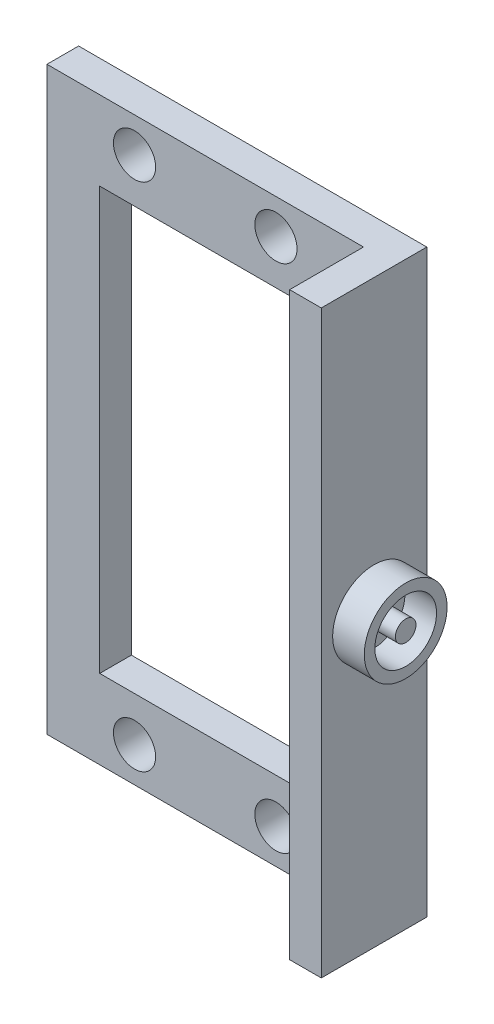
ISO-10303-21;
HEADER;
FILE_DESCRIPTION(('STEP AP214'),'2;1');
FILE_NAME('part.step','',(''),(''),'','','');
FILE_SCHEMA(('AUTOMOTIVE_DESIGN { 1 0 10303 214 1 1 1 1 }'));
ENDSEC;
DATA;
#1=APPLICATION_CONTEXT('core data for automotive mechanical design processes');
#2=APPLICATION_PROTOCOL_DEFINITION('international standard','automotive_design',2000,#1);
#3=PRODUCT_CONTEXT('',#1,'mechanical');
#4=PRODUCT('Part','Part','',(#3));
#5=PRODUCT_RELATED_PRODUCT_CATEGORY('part','',(#4));
#6=PRODUCT_DEFINITION_FORMATION('','',#4);
#7=PRODUCT_DEFINITION_CONTEXT('part definition',#1,'design');
#8=PRODUCT_DEFINITION('design','',#6,#7);
#9=PRODUCT_DEFINITION_SHAPE('','',#8);
#10=(LENGTH_UNIT() NAMED_UNIT(*) SI_UNIT(.MILLI.,.METRE.));
#11=(NAMED_UNIT(*) PLANE_ANGLE_UNIT() SI_UNIT($,.RADIAN.));
#12=(NAMED_UNIT(*) SI_UNIT($,.STERADIAN.) SOLID_ANGLE_UNIT());
#13=UNCERTAINTY_MEASURE_WITH_UNIT(LENGTH_MEASURE(1.E-05),#10,'distance_accuracy_value','');
#14=(GEOMETRIC_REPRESENTATION_CONTEXT(3) GLOBAL_UNCERTAINTY_ASSIGNED_CONTEXT((#13)) GLOBAL_UNIT_ASSIGNED_CONTEXT((#10,
#11,#12)) REPRESENTATION_CONTEXT('',''));
#15=CARTESIAN_POINT('',(0.,0.,0.));
#16=DIRECTION('',(0.,0.,1.));
#17=DIRECTION('',(1.,0.,0.));
#18=AXIS2_PLACEMENT_3D('',#15,#16,#17);
#19=CARTESIAN_POINT('',(0.,0.,3.));
#20=DIRECTION('',(0.,0.,-1.));
#21=DIRECTION('',(-1.,0.,0.));
#22=AXIS2_PLACEMENT_3D('',#19,#20,#21);
#23=PLANE('',#22);
#24=CARTESIAN_POINT('',(-6.69999999999999,44.2,3.));
#25=DIRECTION('',(0.,0.,1.));
#26=DIRECTION('',(1.,0.,0.));
#27=AXIS2_PLACEMENT_3D('',#24,#25,#26);
#28=CIRCLE('',#27,2.);
#29=CARTESIAN_POINT('',(-4.69999999999999,44.2,3.));
#30=VERTEX_POINT('',#29);
#31=EDGE_CURVE('E186',#30,#30,#28,.T.);
#32=ORIENTED_EDGE('',*,*,#31,.F.);
#33=EDGE_LOOP('',(#32));
#34=FACE_BOUND('',#33,.T.);
#35=CARTESIAN_POINT('',(-6.69999999999999,-4.2,3.));
#36=DIRECTION('',(0.,0.,1.));
#37=DIRECTION('',(1.,0.,0.));
#38=AXIS2_PLACEMENT_3D('',#35,#36,#37);
#39=CIRCLE('',#38,2.);
#40=CARTESIAN_POINT('',(-4.69999999999999,-4.2,3.));
#41=VERTEX_POINT('',#40);
#42=EDGE_CURVE('E195',#41,#41,#39,.T.);
#43=ORIENTED_EDGE('',*,*,#42,.F.);
#44=EDGE_LOOP('',(#43));
#45=FACE_BOUND('',#44,.T.);
#46=CARTESIAN_POINT('',(6.70000000000001,44.2,3.));
#47=DIRECTION('',(0.,0.,1.));
#48=DIRECTION('',(1.,0.,0.));
#49=AXIS2_PLACEMENT_3D('',#46,#47,#48);
#50=CIRCLE('',#49,2.);
#51=CARTESIAN_POINT('',(8.70000000000001,44.2,3.));
#52=VERTEX_POINT('',#51);
#53=EDGE_CURVE('E203',#52,#52,#50,.T.);
#54=ORIENTED_EDGE('',*,*,#53,.F.);
#55=EDGE_LOOP('',(#54));
#56=FACE_BOUND('',#55,.T.);
#57=CARTESIAN_POINT('',(6.70000000000001,-4.2,3.));
#58=DIRECTION('',(0.,0.,1.));
#59=DIRECTION('',(1.,0.,0.));
#60=AXIS2_PLACEMENT_3D('',#57,#58,#59);
#61=CIRCLE('',#60,2.);
#62=CARTESIAN_POINT('',(8.70000000000001,-4.2,3.));
#63=VERTEX_POINT('',#62);
#64=EDGE_CURVE('E211',#63,#63,#61,.T.);
#65=ORIENTED_EDGE('',*,*,#64,.F.);
#66=EDGE_LOOP('',(#65));
#67=FACE_BOUND('',#66,.T.);
#68=DIRECTION('',(0.,-1.,0.));
#69=VECTOR('',#68,1.);
#70=CARTESIAN_POINT('',(-15.,-7.5,3.));
#71=LINE('',#70,#69);
#72=CARTESIAN_POINT('',(-15.,47.5,3.));
#73=VERTEX_POINT('',#72);
#74=CARTESIAN_POINT('',(-15.,-7.5,3.));
#75=VERTEX_POINT('',#74);
#76=EDGE_CURVE('E254',#73,#75,#71,.T.);
#77=ORIENTED_EDGE('',*,*,#76,.T.);
#78=DIRECTION('',(1.,0.,0.));
#79=VECTOR('',#78,1.);
#80=CARTESIAN_POINT('',(-15.,-7.5,3.));
#81=LINE('',#80,#79);
#82=CARTESIAN_POINT('',(15.,-7.5,3.));
#83=VERTEX_POINT('',#82);
#84=EDGE_CURVE('E258',#75,#83,#81,.T.);
#85=ORIENTED_EDGE('',*,*,#84,.T.);
#86=DIRECTION('',(0.,1.,0.));
#87=VECTOR('',#86,1.);
#88=CARTESIAN_POINT('',(15.,-7.5,3.));
#89=LINE('',#88,#87);
#90=CARTESIAN_POINT('',(15.,47.5,3.));
#91=VERTEX_POINT('',#90);
#92=EDGE_CURVE('E263',#83,#91,#89,.T.);
#93=ORIENTED_EDGE('',*,*,#92,.T.);
#94=DIRECTION('',(-1.,0.,0.));
#95=VECTOR('',#94,1.);
#96=CARTESIAN_POINT('',(-15.,47.5,3.));
#97=LINE('',#96,#95);
#98=EDGE_CURVE('E267',#91,#73,#97,.T.);
#99=ORIENTED_EDGE('',*,*,#98,.T.);
#100=EDGE_LOOP('',(#77,#85,#93,#99));
#101=FACE_BOUND('',#100,.T.);
#102=DIRECTION('',(0.,-1.,0.));
#103=VECTOR('',#102,1.);
#104=CARTESIAN_POINT('',(-10.,0.,3.));
#105=LINE('',#104,#103);
#106=CARTESIAN_POINT('',(-10.,40.,3.));
#107=VERTEX_POINT('',#106);
#108=CARTESIAN_POINT('',(-10.,0.,3.));
#109=VERTEX_POINT('',#108);
#110=EDGE_CURVE('E216',#107,#109,#105,.T.);
#111=ORIENTED_EDGE('',*,*,#110,.F.);
#112=DIRECTION('',(-1.,0.,0.));
#113=VECTOR('',#112,1.);
#114=CARTESIAN_POINT('',(-10.,40.,3.));
#115=LINE('',#114,#113);
#116=CARTESIAN_POINT('',(10.,40.,3.));
#117=VERTEX_POINT('',#116);
#118=EDGE_CURVE('E226',#117,#107,#115,.T.);
#119=ORIENTED_EDGE('',*,*,#118,.F.);
#120=DIRECTION('',(0.,1.,0.));
#121=VECTOR('',#120,1.);
#122=CARTESIAN_POINT('',(10.,0.,3.));
#123=LINE('',#122,#121);
#124=CARTESIAN_POINT('',(10.,0.,3.));
#125=VERTEX_POINT('',#124);
#126=EDGE_CURVE('E223',#125,#117,#123,.T.);
#127=ORIENTED_EDGE('',*,*,#126,.F.);
#128=DIRECTION('',(1.,0.,0.));
#129=VECTOR('',#128,1.);
#130=CARTESIAN_POINT('',(-10.,0.,3.));
#131=LINE('',#130,#129);
#132=EDGE_CURVE('E219',#109,#125,#131,.T.);
#133=ORIENTED_EDGE('',*,*,#132,.F.);
#134=EDGE_LOOP('',(#111,#119,#127,#133));
#135=FACE_BOUND('',#134,.T.);
#136=ADVANCED_FACE('F57',(#34,#45,#56,#67,#101,#135),#23,.F.);
#137=CARTESIAN_POINT('',(0.,0.,0.));
#138=DIRECTION('',(0.,0.,-1.));
#139=DIRECTION('',(-1.,0.,0.));
#140=AXIS2_PLACEMENT_3D('',#137,#138,#139);
#141=PLANE('',#140);
#142=CARTESIAN_POINT('',(-6.69999999999999,44.2,0.));
#143=DIRECTION('',(0.,0.,-1.));
#144=DIRECTION('',(-1.,0.,0.));
#145=AXIS2_PLACEMENT_3D('',#142,#143,#144);
#146=CIRCLE('',#145,2.);
#147=CARTESIAN_POINT('',(-8.69999999999999,44.2,0.));
#148=VERTEX_POINT('',#147);
#149=EDGE_CURVE('E191',#148,#148,#146,.T.);
#150=ORIENTED_EDGE('',*,*,#149,.F.);
#151=EDGE_LOOP('',(#150));
#152=FACE_BOUND('',#151,.T.);
#153=CARTESIAN_POINT('',(-6.69999999999999,-4.2,0.));
#154=DIRECTION('',(0.,0.,-1.));
#155=DIRECTION('',(-1.,0.,0.));
#156=AXIS2_PLACEMENT_3D('',#153,#154,#155);
#157=CIRCLE('',#156,2.);
#158=CARTESIAN_POINT('',(-8.69999999999999,-4.2,0.));
#159=VERTEX_POINT('',#158);
#160=EDGE_CURVE('E199',#159,#159,#157,.T.);
#161=ORIENTED_EDGE('',*,*,#160,.F.);
#162=EDGE_LOOP('',(#161));
#163=FACE_BOUND('',#162,.T.);
#164=CARTESIAN_POINT('',(6.70000000000001,44.2,0.));
#165=DIRECTION('',(0.,0.,-1.));
#166=DIRECTION('',(-1.,0.,0.));
#167=AXIS2_PLACEMENT_3D('',#164,#165,#166);
#168=CIRCLE('',#167,2.);
#169=CARTESIAN_POINT('',(4.70000000000001,44.2,0.));
#170=VERTEX_POINT('',#169);
#171=EDGE_CURVE('E207',#170,#170,#168,.T.);
#172=ORIENTED_EDGE('',*,*,#171,.F.);
#173=EDGE_LOOP('',(#172));
#174=FACE_BOUND('',#173,.T.);
#175=CARTESIAN_POINT('',(6.70000000000001,-4.2,0.));
#176=DIRECTION('',(0.,0.,-1.));
#177=DIRECTION('',(-1.,0.,0.));
#178=AXIS2_PLACEMENT_3D('',#175,#176,#177);
#179=CIRCLE('',#178,2.);
#180=CARTESIAN_POINT('',(4.70000000000001,-4.2,0.));
#181=VERTEX_POINT('',#180);
#182=EDGE_CURVE('E215',#181,#181,#179,.T.);
#183=ORIENTED_EDGE('',*,*,#182,.F.);
#184=EDGE_LOOP('',(#183));
#185=FACE_BOUND('',#184,.T.);
#186=DIRECTION('',(0.,-1.,0.));
#187=VECTOR('',#186,1.);
#188=CARTESIAN_POINT('',(-15.,-7.5,0.));
#189=LINE('',#188,#187);
#190=CARTESIAN_POINT('',(-15.,47.5,0.));
#191=VERTEX_POINT('',#190);
#192=CARTESIAN_POINT('',(-15.,-7.5,0.));
#193=VERTEX_POINT('',#192);
#194=EDGE_CURVE('E253',#191,#193,#189,.T.);
#195=ORIENTED_EDGE('',*,*,#194,.F.);
#196=DIRECTION('',(-1.,0.,0.));
#197=VECTOR('',#196,1.);
#198=CARTESIAN_POINT('',(-15.,47.5,0.));
#199=LINE('',#198,#197);
#200=CARTESIAN_POINT('',(18.,47.5,0.));
#201=VERTEX_POINT('',#200);
#202=EDGE_CURVE('E259',#201,#191,#199,.T.);
#203=ORIENTED_EDGE('',*,*,#202,.F.);
#204=DIRECTION('',(0.,1.,0.));
#205=VECTOR('',#204,1.);
#206=CARTESIAN_POINT('',(18.,-7.5,0.));
#207=LINE('',#206,#205);
#208=CARTESIAN_POINT('',(18.,-7.5,0.));
#209=VERTEX_POINT('',#208);
#210=EDGE_CURVE('E150',#209,#201,#207,.T.);
#211=ORIENTED_EDGE('',*,*,#210,.F.);
#212=DIRECTION('',(1.,0.,0.));
#213=VECTOR('',#212,1.);
#214=CARTESIAN_POINT('',(-15.,-7.5,0.));
#215=LINE('',#214,#213);
#216=EDGE_CURVE('E164',#193,#209,#215,.T.);
#217=ORIENTED_EDGE('',*,*,#216,.F.);
#218=EDGE_LOOP('',(#195,#203,#211,#217));
#219=FACE_BOUND('',#218,.T.);
#220=DIRECTION('',(-1.,0.,0.));
#221=VECTOR('',#220,1.);
#222=CARTESIAN_POINT('',(-10.,40.,0.));
#223=LINE('',#222,#221);
#224=CARTESIAN_POINT('',(10.,40.,0.));
#225=VERTEX_POINT('',#224);
#226=CARTESIAN_POINT('',(-10.,40.,0.));
#227=VERTEX_POINT('',#226);
#228=EDGE_CURVE('E220',#225,#227,#223,.T.);
#229=ORIENTED_EDGE('',*,*,#228,.T.);
#230=DIRECTION('',(0.,-1.,0.));
#231=VECTOR('',#230,1.);
#232=CARTESIAN_POINT('',(-10.,0.,0.));
#233=LINE('',#232,#231);
#234=CARTESIAN_POINT('',(-10.,0.,0.));
#235=VERTEX_POINT('',#234);
#236=EDGE_CURVE('E81',#227,#235,#233,.T.);
#237=ORIENTED_EDGE('',*,*,#236,.T.);
#238=DIRECTION('',(1.,0.,0.));
#239=VECTOR('',#238,1.);
#240=CARTESIAN_POINT('',(-10.,0.,0.));
#241=LINE('',#240,#239);
#242=CARTESIAN_POINT('',(10.,0.,0.));
#243=VERTEX_POINT('',#242);
#244=EDGE_CURVE('E232',#235,#243,#241,.T.);
#245=ORIENTED_EDGE('',*,*,#244,.T.);
#246=DIRECTION('',(0.,1.,0.));
#247=VECTOR('',#246,1.);
#248=CARTESIAN_POINT('',(10.,0.,0.));
#249=LINE('',#248,#247);
#250=EDGE_CURVE('E236',#243,#225,#249,.T.);
#251=ORIENTED_EDGE('',*,*,#250,.T.);
#252=EDGE_LOOP('',(#229,#237,#245,#251));
#253=FACE_BOUND('',#252,.T.);
#254=ADVANCED_FACE('F289',(#152,#163,#174,#185,#219,#253),#141,.T.);
#255=CARTESIAN_POINT('',(-15.,-7.5,3.));
#256=DIRECTION('',(1.,0.,0.));
#257=DIRECTION('',(0.,0.,-1.));
#258=AXIS2_PLACEMENT_3D('',#255,#256,#257);
#259=PLANE('',#258);
#260=ORIENTED_EDGE('',*,*,#194,.T.);
#261=DIRECTION('',(0.,0.,-1.));
#262=VECTOR('',#261,1.);
#263=CARTESIAN_POINT('',(-15.,-7.5,3.));
#264=LINE('',#263,#262);
#265=EDGE_CURVE('E66',#75,#193,#264,.T.);
#266=ORIENTED_EDGE('',*,*,#265,.F.);
#267=ORIENTED_EDGE('',*,*,#76,.F.);
#268=DIRECTION('',(0.,0.,-1.));
#269=VECTOR('',#268,1.);
#270=CARTESIAN_POINT('',(-15.,47.5,3.));
#271=LINE('',#270,#269);
#272=EDGE_CURVE('E270',#73,#191,#271,.T.);
#273=ORIENTED_EDGE('',*,*,#272,.T.);
#274=EDGE_LOOP('',(#260,#266,#267,#273));
#275=FACE_BOUND('',#274,.T.);
#276=ADVANCED_FACE('F59',(#275),#259,.F.);
#277=CARTESIAN_POINT('',(-15.,-7.5,3.));
#278=DIRECTION('',(0.,1.,0.));
#279=DIRECTION('',(0.,0.,1.));
#280=AXIS2_PLACEMENT_3D('',#277,#278,#279);
#281=PLANE('',#280);
#282=ORIENTED_EDGE('',*,*,#216,.T.);
#283=DIRECTION('',(0.,0.,1.));
#284=VECTOR('',#283,1.);
#285=CARTESIAN_POINT('',(18.,-7.5,0.));
#286=LINE('',#285,#284);
#287=CARTESIAN_POINT('',(18.,-7.5,10.));
#288=VERTEX_POINT('',#287);
#289=EDGE_CURVE('E156',#209,#288,#286,.T.);
#290=ORIENTED_EDGE('',*,*,#289,.T.);
#291=DIRECTION('',(-1.,0.,0.));
#292=VECTOR('',#291,1.);
#293=CARTESIAN_POINT('',(18.,-7.5,10.));
#294=LINE('',#293,#292);
#295=CARTESIAN_POINT('',(15.,-7.5,10.));
#296=VERTEX_POINT('',#295);
#297=EDGE_CURVE('E138',#288,#296,#294,.T.);
#298=ORIENTED_EDGE('',*,*,#297,.T.);
#299=DIRECTION('',(0.,0.,1.));
#300=VECTOR('',#299,1.);
#301=CARTESIAN_POINT('',(15.,-7.5,0.));
#302=LINE('',#301,#300);
#303=EDGE_CURVE('E179',#83,#296,#302,.T.);
#304=ORIENTED_EDGE('',*,*,#303,.F.);
#305=ORIENTED_EDGE('',*,*,#84,.F.);
#306=ORIENTED_EDGE('',*,*,#265,.T.);
#307=EDGE_LOOP('',(#282,#290,#298,#304,#305,#306));
#308=FACE_BOUND('',#307,.T.);
#309=ADVANCED_FACE('F162',(#308),#281,.F.);
#310=CARTESIAN_POINT('',(-15.,47.5,3.));
#311=DIRECTION('',(0.,-1.,0.));
#312=DIRECTION('',(0.,0.,-1.));
#313=AXIS2_PLACEMENT_3D('',#310,#311,#312);
#314=PLANE('',#313);
#315=ORIENTED_EDGE('',*,*,#202,.T.);
#316=ORIENTED_EDGE('',*,*,#272,.F.);
#317=ORIENTED_EDGE('',*,*,#98,.F.);
#318=DIRECTION('',(0.,0.,1.));
#319=VECTOR('',#318,1.);
#320=CARTESIAN_POINT('',(15.,47.5,0.));
#321=LINE('',#320,#319);
#322=CARTESIAN_POINT('',(15.,47.5,10.));
#323=VERTEX_POINT('',#322);
#324=EDGE_CURVE('E167',#91,#323,#321,.T.);
#325=ORIENTED_EDGE('',*,*,#324,.T.);
#326=DIRECTION('',(-1.,0.,0.));
#327=VECTOR('',#326,1.);
#328=CARTESIAN_POINT('',(18.,47.5,10.));
#329=LINE('',#328,#327);
#330=CARTESIAN_POINT('',(18.,47.5,10.));
#331=VERTEX_POINT('',#330);
#332=EDGE_CURVE('E149',#331,#323,#329,.T.);
#333=ORIENTED_EDGE('',*,*,#332,.F.);
#334=DIRECTION('',(0.,0.,1.));
#335=VECTOR('',#334,1.);
#336=CARTESIAN_POINT('',(18.,47.5,0.));
#337=LINE('',#336,#335);
#338=EDGE_CURVE('E158',#201,#331,#337,.T.);
#339=ORIENTED_EDGE('',*,*,#338,.F.);
#340=EDGE_LOOP('',(#315,#316,#317,#325,#333,#339));
#341=FACE_BOUND('',#340,.T.);
#342=ADVANCED_FACE('F327',(#341),#314,.F.);
#343=CARTESIAN_POINT('',(-10.,0.,3.));
#344=DIRECTION('',(1.,0.,0.));
#345=DIRECTION('',(0.,0.,-1.));
#346=AXIS2_PLACEMENT_3D('',#343,#344,#345);
#347=PLANE('',#346);
#348=ORIENTED_EDGE('',*,*,#236,.F.);
#349=DIRECTION('',(0.,0.,-1.));
#350=VECTOR('',#349,1.);
#351=CARTESIAN_POINT('',(-10.,40.,3.));
#352=LINE('',#351,#350);
#353=EDGE_CURVE('E229',#107,#227,#352,.T.);
#354=ORIENTED_EDGE('',*,*,#353,.F.);
#355=ORIENTED_EDGE('',*,*,#110,.T.);
#356=DIRECTION('',(0.,0.,-1.));
#357=VECTOR('',#356,1.);
#358=CARTESIAN_POINT('',(-10.,0.,3.));
#359=LINE('',#358,#357);
#360=EDGE_CURVE('E250',#109,#235,#359,.T.);
#361=ORIENTED_EDGE('',*,*,#360,.T.);
#362=EDGE_LOOP('',(#348,#354,#355,#361));
#363=FACE_BOUND('',#362,.T.);
#364=ADVANCED_FACE('F300',(#363),#347,.T.);
#365=CARTESIAN_POINT('',(-10.,0.,3.));
#366=DIRECTION('',(0.,1.,0.));
#367=DIRECTION('',(0.,0.,1.));
#368=AXIS2_PLACEMENT_3D('',#365,#366,#367);
#369=PLANE('',#368);
#370=ORIENTED_EDGE('',*,*,#244,.F.);
#371=ORIENTED_EDGE('',*,*,#360,.F.);
#372=ORIENTED_EDGE('',*,*,#132,.T.);
#373=DIRECTION('',(0.,0.,-1.));
#374=VECTOR('',#373,1.);
#375=CARTESIAN_POINT('',(10.,0.,3.));
#376=LINE('',#375,#374);
#377=EDGE_CURVE('E247',#125,#243,#376,.T.);
#378=ORIENTED_EDGE('',*,*,#377,.T.);
#379=EDGE_LOOP('',(#370,#371,#372,#378));
#380=FACE_BOUND('',#379,.T.);
#381=ADVANCED_FACE('F307',(#380),#369,.T.);
#382=CARTESIAN_POINT('',(10.,0.,3.));
#383=DIRECTION('',(-1.,0.,0.));
#384=DIRECTION('',(0.,0.,1.));
#385=AXIS2_PLACEMENT_3D('',#382,#383,#384);
#386=PLANE('',#385);
#387=ORIENTED_EDGE('',*,*,#250,.F.);
#388=ORIENTED_EDGE('',*,*,#377,.F.);
#389=ORIENTED_EDGE('',*,*,#126,.T.);
#390=DIRECTION('',(0.,0.,-1.));
#391=VECTOR('',#390,1.);
#392=CARTESIAN_POINT('',(10.,40.,3.));
#393=LINE('',#392,#391);
#394=EDGE_CURVE('E73',#117,#225,#393,.T.);
#395=ORIENTED_EDGE('',*,*,#394,.T.);
#396=EDGE_LOOP('',(#387,#388,#389,#395));
#397=FACE_BOUND('',#396,.T.);
#398=ADVANCED_FACE('F309',(#397),#386,.T.);
#399=CARTESIAN_POINT('',(-10.,40.,3.));
#400=DIRECTION('',(0.,-1.,0.));
#401=DIRECTION('',(0.,0.,-1.));
#402=AXIS2_PLACEMENT_3D('',#399,#400,#401);
#403=PLANE('',#402);
#404=ORIENTED_EDGE('',*,*,#228,.F.);
#405=ORIENTED_EDGE('',*,*,#394,.F.);
#406=ORIENTED_EDGE('',*,*,#118,.T.);
#407=ORIENTED_EDGE('',*,*,#353,.T.);
#408=EDGE_LOOP('',(#404,#405,#406,#407));
#409=FACE_BOUND('',#408,.T.);
#410=ADVANCED_FACE('F297',(#409),#403,.T.);
#411=CARTESIAN_POINT('',(6.70000000000001,-4.2,3.));
#412=DIRECTION('',(0.,0.,1.));
#413=DIRECTION('',(1.,0.,0.));
#414=AXIS2_PLACEMENT_3D('',#411,#412,#413);
#415=CYLINDRICAL_SURFACE('',#414,2.);
#416=ORIENTED_EDGE('',*,*,#182,.T.);
#417=EDGE_LOOP('',(#416));
#418=FACE_BOUND('',#417,.T.);
#419=ORIENTED_EDGE('',*,*,#64,.T.);
#420=EDGE_LOOP('',(#419));
#421=FACE_BOUND('',#420,.T.);
#422=ADVANCED_FACE('F286',(#418,#421),#415,.F.);
#423=CARTESIAN_POINT('',(6.70000000000001,44.2,3.));
#424=DIRECTION('',(0.,0.,1.));
#425=DIRECTION('',(1.,0.,0.));
#426=AXIS2_PLACEMENT_3D('',#423,#424,#425);
#427=CYLINDRICAL_SURFACE('',#426,2.);
#428=ORIENTED_EDGE('',*,*,#171,.T.);
#429=EDGE_LOOP('',(#428));
#430=FACE_BOUND('',#429,.T.);
#431=ORIENTED_EDGE('',*,*,#53,.T.);
#432=EDGE_LOOP('',(#431));
#433=FACE_BOUND('',#432,.T.);
#434=ADVANCED_FACE('F360',(#430,#433),#427,.F.);
#435=CARTESIAN_POINT('',(-6.69999999999999,-4.2,3.));
#436=DIRECTION('',(0.,0.,1.));
#437=DIRECTION('',(1.,0.,0.));
#438=AXIS2_PLACEMENT_3D('',#435,#436,#437);
#439=CYLINDRICAL_SURFACE('',#438,2.);
#440=ORIENTED_EDGE('',*,*,#160,.T.);
#441=EDGE_LOOP('',(#440));
#442=FACE_BOUND('',#441,.T.);
#443=ORIENTED_EDGE('',*,*,#42,.T.);
#444=EDGE_LOOP('',(#443));
#445=FACE_BOUND('',#444,.T.);
#446=ADVANCED_FACE('F352',(#442,#445),#439,.F.);
#447=CARTESIAN_POINT('',(-6.69999999999999,44.2,3.));
#448=DIRECTION('',(0.,0.,1.));
#449=DIRECTION('',(1.,0.,0.));
#450=AXIS2_PLACEMENT_3D('',#447,#448,#449);
#451=CYLINDRICAL_SURFACE('',#450,2.);
#452=ORIENTED_EDGE('',*,*,#149,.T.);
#453=EDGE_LOOP('',(#452));
#454=FACE_BOUND('',#453,.T.);
#455=ORIENTED_EDGE('',*,*,#31,.T.);
#456=EDGE_LOOP('',(#455));
#457=FACE_BOUND('',#456,.T.);
#458=ADVANCED_FACE('F345',(#454,#457),#451,.F.);
#459=CARTESIAN_POINT('',(15.,0.,0.));
#460=DIRECTION('',(-1.,0.,0.));
#461=DIRECTION('',(0.,0.,1.));
#462=AXIS2_PLACEMENT_3D('',#459,#460,#461);
#463=PLANE('',#462);
#464=ORIENTED_EDGE('',*,*,#92,.F.);
#465=ORIENTED_EDGE('',*,*,#303,.T.);
#466=DIRECTION('',(0.,1.,0.));
#467=VECTOR('',#466,1.);
#468=CARTESIAN_POINT('',(15.,-7.5,10.));
#469=LINE('',#468,#467);
#470=EDGE_CURVE('E144',#296,#323,#469,.T.);
#471=ORIENTED_EDGE('',*,*,#470,.T.);
#472=ORIENTED_EDGE('',*,*,#324,.F.);
#473=EDGE_LOOP('',(#464,#465,#471,#472));
#474=FACE_BOUND('',#473,.T.);
#475=ADVANCED_FACE('F343',(#474),#463,.T.);
#476=CARTESIAN_POINT('',(18.,-7.5,10.));
#477=DIRECTION('',(0.,0.,1.));
#478=DIRECTION('',(1.,0.,0.));
#479=AXIS2_PLACEMENT_3D('',#476,#477,#478);
#480=PLANE('',#479);
#481=ORIENTED_EDGE('',*,*,#470,.F.);
#482=ORIENTED_EDGE('',*,*,#297,.F.);
#483=DIRECTION('',(0.,1.,0.));
#484=VECTOR('',#483,1.);
#485=CARTESIAN_POINT('',(18.,-7.5,10.));
#486=LINE('',#485,#484);
#487=EDGE_CURVE('E142',#288,#331,#486,.T.);
#488=ORIENTED_EDGE('',*,*,#487,.T.);
#489=ORIENTED_EDGE('',*,*,#332,.T.);
#490=EDGE_LOOP('',(#481,#482,#488,#489));
#491=FACE_BOUND('',#490,.T.);
#492=ADVANCED_FACE('F140',(#491),#480,.T.);
#493=CARTESIAN_POINT('',(18.,0.,0.));
#494=DIRECTION('',(-1.,0.,0.));
#495=DIRECTION('',(0.,0.,1.));
#496=AXIS2_PLACEMENT_3D('',#493,#494,#495);
#497=PLANE('',#496);
#498=CARTESIAN_POINT('',(18.,20.,5.));
#499=DIRECTION('',(-1.,0.,0.));
#500=DIRECTION('',(0.,0.,1.));
#501=AXIS2_PLACEMENT_3D('',#498,#499,#500);
#502=CIRCLE('',#501,3.925);
#503=CARTESIAN_POINT('',(18.,20.,8.925));
#504=VERTEX_POINT('',#503);
#505=EDGE_CURVE('E172',#504,#504,#502,.T.);
#506=ORIENTED_EDGE('',*,*,#505,.T.);
#507=EDGE_LOOP('',(#506));
#508=FACE_BOUND('',#507,.T.);
#509=ORIENTED_EDGE('',*,*,#289,.F.);
#510=ORIENTED_EDGE('',*,*,#210,.T.);
#511=ORIENTED_EDGE('',*,*,#338,.T.);
#512=ORIENTED_EDGE('',*,*,#487,.F.);
#513=EDGE_LOOP('',(#509,#510,#511,#512));
#514=FACE_BOUND('',#513,.T.);
#515=ADVANCED_FACE('F154',(#508,#514),#497,.F.);
#516=CARTESIAN_POINT('',(21.,20.,5.));
#517=DIRECTION('',(-1.,0.,0.));
#518=DIRECTION('',(0.,0.,1.));
#519=AXIS2_PLACEMENT_3D('',#516,#517,#518);
#520=CYLINDRICAL_SURFACE('',#519,3.925);
#521=CARTESIAN_POINT('',(21.,20.,5.));
#522=DIRECTION('',(-1.,0.,0.));
#523=DIRECTION('',(0.,0.,1.));
#524=AXIS2_PLACEMENT_3D('',#521,#522,#523);
#525=CIRCLE('',#524,3.925);
#526=CARTESIAN_POINT('',(21.,20.,8.925));
#527=VERTEX_POINT('',#526);
#528=EDGE_CURVE('E182',#527,#527,#525,.T.);
#529=ORIENTED_EDGE('',*,*,#528,.T.);
#530=EDGE_LOOP('',(#529));
#531=FACE_BOUND('',#530,.T.);
#532=ORIENTED_EDGE('',*,*,#505,.F.);
#533=EDGE_LOOP('',(#532));
#534=FACE_BOUND('',#533,.T.);
#535=ADVANCED_FACE('F425',(#531,#534),#520,.T.);
#536=CARTESIAN_POINT('',(21.,20.,5.));
#537=DIRECTION('',(-1.,0.,0.));
#538=DIRECTION('',(0.,0.,1.));
#539=AXIS2_PLACEMENT_3D('',#536,#537,#538);
#540=PLANE('',#539);
#541=CARTESIAN_POINT('',(21.,20.,5.));
#542=DIRECTION('',(-1.,0.,0.));
#543=DIRECTION('',(0.,0.,1.));
#544=AXIS2_PLACEMENT_3D('',#541,#542,#543);
#545=CIRCLE('',#544,2.925);
#546=CARTESIAN_POINT('',(21.,20.,7.925));
#547=VERTEX_POINT('',#546);
#548=EDGE_CURVE('E495',#547,#547,#545,.T.);
#549=ORIENTED_EDGE('',*,*,#548,.T.);
#550=EDGE_LOOP('',(#549));
#551=FACE_BOUND('',#550,.T.);
#552=ORIENTED_EDGE('',*,*,#528,.F.);
#553=EDGE_LOOP('',(#552));
#554=FACE_BOUND('',#553,.T.);
#555=ADVANCED_FACE('F436',(#551,#554),#540,.F.);
#556=CARTESIAN_POINT('',(21.,20.,5.));
#557=DIRECTION('',(-1.,0.,0.));
#558=DIRECTION('',(0.,0.,1.));
#559=AXIS2_PLACEMENT_3D('',#556,#557,#558);
#560=CYLINDRICAL_SURFACE('',#559,2.925);
#561=ORIENTED_EDGE('',*,*,#548,.F.);
#562=EDGE_LOOP('',(#561));
#563=FACE_BOUND('',#562,.T.);
#564=CARTESIAN_POINT('',(18.,20.,5.));
#565=DIRECTION('',(-1.,0.,0.));
#566=DIRECTION('',(0.,0.,1.));
#567=AXIS2_PLACEMENT_3D('',#564,#565,#566);
#568=CIRCLE('',#567,2.925);
#569=CARTESIAN_POINT('',(18.,20.,7.925));
#570=VERTEX_POINT('',#569);
#571=EDGE_CURVE('E12',#570,#570,#568,.T.);
#572=ORIENTED_EDGE('',*,*,#571,.T.);
#573=EDGE_LOOP('',(#572));
#574=FACE_BOUND('',#573,.T.);
#575=ADVANCED_FACE('F446',(#563,#574),#560,.F.);
#576=CARTESIAN_POINT('',(18.,20.,5.));
#577=DIRECTION('',(-1.,0.,0.));
#578=DIRECTION('',(0.,0.,1.));
#579=AXIS2_PLACEMENT_3D('',#576,#577,#578);
#580=CIRCLE('',#579,0.975);
#581=CARTESIAN_POINT('',(18.,20.,5.975));
#582=VERTEX_POINT('',#581);
#583=EDGE_CURVE('E491',#582,#582,#580,.T.);
#584=ORIENTED_EDGE('',*,*,#583,.T.);
#585=EDGE_LOOP('',(#584));
#586=FACE_BOUND('',#585,.T.);
#587=ORIENTED_EDGE('',*,*,#571,.F.);
#588=EDGE_LOOP('',(#587));
#589=FACE_BOUND('',#588,.T.);
#590=ADVANCED_FACE('F427',(#586,#589),#497,.F.);
#591=CARTESIAN_POINT('',(21.,20.,5.));
#592=DIRECTION('',(-1.,0.,0.));
#593=DIRECTION('',(0.,0.,1.));
#594=AXIS2_PLACEMENT_3D('',#591,#592,#593);
#595=CYLINDRICAL_SURFACE('',#594,0.975);
#596=CARTESIAN_POINT('',(21.,20.,5.));
#597=DIRECTION('',(-1.,0.,0.));
#598=DIRECTION('',(0.,0.,1.));
#599=AXIS2_PLACEMENT_3D('',#596,#597,#598);
#600=CIRCLE('',#599,0.975);
#601=CARTESIAN_POINT('',(21.,20.,5.975));
#602=VERTEX_POINT('',#601);
#603=EDGE_CURVE('E489',#602,#602,#600,.T.);
#604=ORIENTED_EDGE('',*,*,#603,.T.);
#605=EDGE_LOOP('',(#604));
#606=FACE_BOUND('',#605,.T.);
#607=ORIENTED_EDGE('',*,*,#583,.F.);
#608=EDGE_LOOP('',(#607));
#609=FACE_BOUND('',#608,.T.);
#610=ADVANCED_FACE('F465',(#606,#609),#595,.T.);
#611=CARTESIAN_POINT('',(21.,20.,5.));
#612=DIRECTION('',(-1.,0.,0.));
#613=DIRECTION('',(0.,0.,1.));
#614=AXIS2_PLACEMENT_3D('',#611,#612,#613);
#615=PLANE('',#614);
#616=ORIENTED_EDGE('',*,*,#603,.F.);
#617=EDGE_LOOP('',(#616));
#618=FACE_BOUND('',#617,.T.);
#619=ADVANCED_FACE('F473',(#618),#615,.F.);
#620=CLOSED_SHELL('',(#136,#254,#276,#309,#342,#364,#381,#398,#410,#422,#434,#446,#458,#475,
#492,#515,#535,#555,#575,#590,#610,#619));
#621=MANIFOLD_SOLID_BREP('B2',#620);
#622=ADVANCED_BREP_SHAPE_REPRESENTATION('',(#18,#621),#14);
#623=SHAPE_DEFINITION_REPRESENTATION(#9,#622);
ENDSEC;
END-ISO-10303-21;
